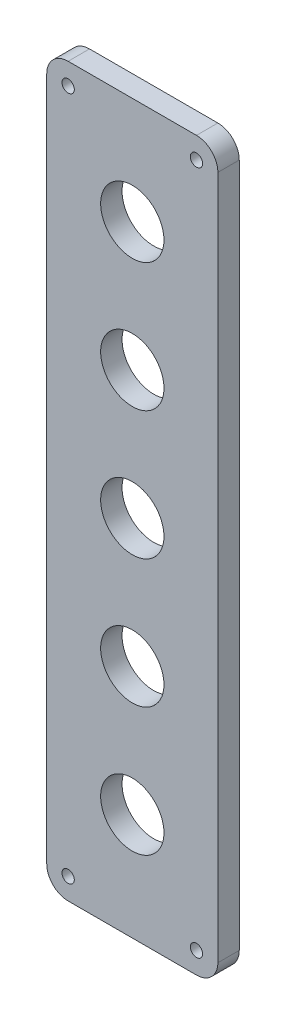
ISO-10303-21;
HEADER;
FILE_DESCRIPTION(('STEP AP214'),'2;1');
FILE_NAME('part.step','',(''),(''),'','','');
FILE_SCHEMA(('AUTOMOTIVE_DESIGN { 1 0 10303 214 1 1 1 1 }'));
ENDSEC;
DATA;
#1=APPLICATION_CONTEXT('core data for automotive mechanical design processes');
#2=APPLICATION_PROTOCOL_DEFINITION('international standard','automotive_design',2000,#1);
#3=PRODUCT_CONTEXT('',#1,'mechanical');
#4=PRODUCT('Part','Part','',(#3));
#5=PRODUCT_RELATED_PRODUCT_CATEGORY('part','',(#4));
#6=PRODUCT_DEFINITION_FORMATION('','',#4);
#7=PRODUCT_DEFINITION_CONTEXT('part definition',#1,'design');
#8=PRODUCT_DEFINITION('design','',#6,#7);
#9=PRODUCT_DEFINITION_SHAPE('','',#8);
#10=(LENGTH_UNIT() NAMED_UNIT(*) SI_UNIT(.MILLI.,.METRE.));
#11=(NAMED_UNIT(*) PLANE_ANGLE_UNIT() SI_UNIT($,.RADIAN.));
#12=(NAMED_UNIT(*) SI_UNIT($,.STERADIAN.) SOLID_ANGLE_UNIT());
#13=UNCERTAINTY_MEASURE_WITH_UNIT(LENGTH_MEASURE(1.E-05),#10,'distance_accuracy_value','');
#14=(GEOMETRIC_REPRESENTATION_CONTEXT(3) GLOBAL_UNCERTAINTY_ASSIGNED_CONTEXT((#13)) GLOBAL_UNIT_ASSIGNED_CONTEXT((#10,
#11,#12)) REPRESENTATION_CONTEXT('',''));
#15=CARTESIAN_POINT('',(0.,0.,0.));
#16=DIRECTION('',(0.,0.,1.));
#17=DIRECTION('',(1.,0.,0.));
#18=AXIS2_PLACEMENT_3D('',#15,#16,#17);
#19=CARTESIAN_POINT('',(25.4,-107.95,6.35));
#20=DIRECTION('',(-1.,0.,0.));
#21=DIRECTION('',(0.,0.,1.));
#22=AXIS2_PLACEMENT_3D('',#19,#20,#21);
#23=PLANE('',#22);
#24=DIRECTION('',(0.,1.,0.));
#25=VECTOR('',#24,1.);
#26=CARTESIAN_POINT('',(25.4,-107.95,6.35));
#27=LINE('',#26,#25);
#28=CARTESIAN_POINT('',(25.4,-101.6,6.35));
#29=VERTEX_POINT('',#28);
#30=CARTESIAN_POINT('',(25.4,101.6,6.35));
#31=VERTEX_POINT('',#30);
#32=EDGE_CURVE('E128',#29,#31,#27,.T.);
#33=ORIENTED_EDGE('',*,*,#32,.F.);
#34=DIRECTION('',(0.,0.,-1.));
#35=VECTOR('',#34,1.);
#36=CARTESIAN_POINT('',(25.4,-101.6,6.35));
#37=LINE('',#36,#35);
#38=CARTESIAN_POINT('',(25.4,-101.6,0.));
#39=VERTEX_POINT('',#38);
#40=EDGE_CURVE('E154',#29,#39,#37,.T.);
#41=ORIENTED_EDGE('',*,*,#40,.T.);
#42=DIRECTION('',(0.,1.,0.));
#43=VECTOR('',#42,1.);
#44=CARTESIAN_POINT('',(25.4,-107.95,0.));
#45=LINE('',#44,#43);
#46=CARTESIAN_POINT('',(25.4,101.6,0.));
#47=VERTEX_POINT('',#46);
#48=EDGE_CURVE('E160',#39,#47,#45,.T.);
#49=ORIENTED_EDGE('',*,*,#48,.T.);
#50=DIRECTION('',(0.,0.,-1.));
#51=VECTOR('',#50,1.);
#52=CARTESIAN_POINT('',(25.4,101.6,6.35));
#53=LINE('',#52,#51);
#54=EDGE_CURVE('E152',#47,#31,#53,.F.);
#55=ORIENTED_EDGE('',*,*,#54,.T.);
#56=EDGE_LOOP('',(#33,#41,#49,#55));
#57=FACE_BOUND('',#56,.T.);
#58=ADVANCED_FACE('F36',(#57),#23,.F.);
#59=CARTESIAN_POINT('',(-25.4,107.95,6.35));
#60=DIRECTION('',(0.,-1.,0.));
#61=DIRECTION('',(0.,0.,-1.));
#62=AXIS2_PLACEMENT_3D('',#59,#60,#61);
#63=PLANE('',#62);
#64=DIRECTION('',(-1.,0.,0.));
#65=VECTOR('',#64,1.);
#66=CARTESIAN_POINT('',(-25.4,107.95,6.35));
#67=LINE('',#66,#65);
#68=CARTESIAN_POINT('',(19.05,107.95,6.35));
#69=VERTEX_POINT('',#68);
#70=CARTESIAN_POINT('',(-19.05,107.95,6.35));
#71=VERTEX_POINT('',#70);
#72=EDGE_CURVE('E131',#69,#71,#67,.T.);
#73=ORIENTED_EDGE('',*,*,#72,.F.);
#74=DIRECTION('',(0.,0.,-1.));
#75=VECTOR('',#74,1.);
#76=CARTESIAN_POINT('',(19.05,107.95,6.35));
#77=LINE('',#76,#75);
#78=CARTESIAN_POINT('',(19.05,107.95,0.));
#79=VERTEX_POINT('',#78);
#80=EDGE_CURVE('E11',#69,#79,#77,.T.);
#81=ORIENTED_EDGE('',*,*,#80,.T.);
#82=DIRECTION('',(-1.,0.,0.));
#83=VECTOR('',#82,1.);
#84=CARTESIAN_POINT('',(-25.4,107.95,0.));
#85=LINE('',#84,#83);
#86=CARTESIAN_POINT('',(-19.05,107.95,0.));
#87=VERTEX_POINT('',#86);
#88=EDGE_CURVE('E133',#79,#87,#85,.T.);
#89=ORIENTED_EDGE('',*,*,#88,.T.);
#90=DIRECTION('',(0.,0.,-1.));
#91=VECTOR('',#90,1.);
#92=CARTESIAN_POINT('',(-19.05,107.95,6.35));
#93=LINE('',#92,#91);
#94=EDGE_CURVE('E44',#87,#71,#93,.F.);
#95=ORIENTED_EDGE('',*,*,#94,.T.);
#96=EDGE_LOOP('',(#73,#81,#89,#95));
#97=FACE_BOUND('',#96,.T.);
#98=ADVANCED_FACE('F254',(#97),#63,.F.);
#99=CARTESIAN_POINT('',(-25.4,-107.95,6.35));
#100=DIRECTION('',(1.,0.,0.));
#101=DIRECTION('',(0.,0.,-1.));
#102=AXIS2_PLACEMENT_3D('',#99,#100,#101);
#103=PLANE('',#102);
#104=DIRECTION('',(0.,-1.,0.));
#105=VECTOR('',#104,1.);
#106=CARTESIAN_POINT('',(-25.4,-107.95,0.));
#107=LINE('',#106,#105);
#108=CARTESIAN_POINT('',(-25.4,101.6,0.));
#109=VERTEX_POINT('',#108);
#110=CARTESIAN_POINT('',(-25.4,-101.6,0.));
#111=VERTEX_POINT('',#110);
#112=EDGE_CURVE('E129',#109,#111,#107,.T.);
#113=ORIENTED_EDGE('',*,*,#112,.T.);
#114=DIRECTION('',(0.,0.,-1.));
#115=VECTOR('',#114,1.);
#116=CARTESIAN_POINT('',(-25.4,-101.6,6.35));
#117=LINE('',#116,#115);
#118=CARTESIAN_POINT('',(-25.4,-101.6,6.35));
#119=VERTEX_POINT('',#118);
#120=EDGE_CURVE('E107',#111,#119,#117,.F.);
#121=ORIENTED_EDGE('',*,*,#120,.T.);
#122=DIRECTION('',(0.,-1.,0.));
#123=VECTOR('',#122,1.);
#124=CARTESIAN_POINT('',(-25.4,-107.95,6.35));
#125=LINE('',#124,#123);
#126=CARTESIAN_POINT('',(-25.4,101.6,6.35));
#127=VERTEX_POINT('',#126);
#128=EDGE_CURVE('E172',#127,#119,#125,.T.);
#129=ORIENTED_EDGE('',*,*,#128,.F.);
#130=DIRECTION('',(0.,0.,-1.));
#131=VECTOR('',#130,1.);
#132=CARTESIAN_POINT('',(-25.4,101.6,6.35));
#133=LINE('',#132,#131);
#134=EDGE_CURVE('E112',#127,#109,#133,.T.);
#135=ORIENTED_EDGE('',*,*,#134,.T.);
#136=EDGE_LOOP('',(#113,#121,#129,#135));
#137=FACE_BOUND('',#136,.T.);
#138=ADVANCED_FACE('F252',(#137),#103,.F.);
#139=CARTESIAN_POINT('',(-25.4,-107.95,6.35));
#140=DIRECTION('',(0.,1.,0.));
#141=DIRECTION('',(0.,0.,1.));
#142=AXIS2_PLACEMENT_3D('',#139,#140,#141);
#143=PLANE('',#142);
#144=DIRECTION('',(1.,0.,0.));
#145=VECTOR('',#144,1.);
#146=CARTESIAN_POINT('',(-25.4,-107.95,6.35));
#147=LINE('',#146,#145);
#148=CARTESIAN_POINT('',(-19.05,-107.95,6.35));
#149=VERTEX_POINT('',#148);
#150=CARTESIAN_POINT('',(19.05,-107.95,6.35));
#151=VERTEX_POINT('',#150);
#152=EDGE_CURVE('E122',#149,#151,#147,.T.);
#153=ORIENTED_EDGE('',*,*,#152,.F.);
#154=DIRECTION('',(0.,0.,-1.));
#155=VECTOR('',#154,1.);
#156=CARTESIAN_POINT('',(-19.05,-107.95,6.35));
#157=LINE('',#156,#155);
#158=CARTESIAN_POINT('',(-19.05,-107.95,0.));
#159=VERTEX_POINT('',#158);
#160=EDGE_CURVE('E106',#149,#159,#157,.T.);
#161=ORIENTED_EDGE('',*,*,#160,.T.);
#162=DIRECTION('',(1.,0.,0.));
#163=VECTOR('',#162,1.);
#164=CARTESIAN_POINT('',(-25.4,-107.95,0.));
#165=LINE('',#164,#163);
#166=CARTESIAN_POINT('',(19.05,-107.95,0.));
#167=VERTEX_POINT('',#166);
#168=EDGE_CURVE('E119',#159,#167,#165,.T.);
#169=ORIENTED_EDGE('',*,*,#168,.T.);
#170=DIRECTION('',(0.,0.,-1.));
#171=VECTOR('',#170,1.);
#172=CARTESIAN_POINT('',(19.05,-107.95,6.35));
#173=LINE('',#172,#171);
#174=EDGE_CURVE('E124',#167,#151,#173,.F.);
#175=ORIENTED_EDGE('',*,*,#174,.T.);
#176=EDGE_LOOP('',(#153,#161,#169,#175));
#177=FACE_BOUND('',#176,.T.);
#178=ADVANCED_FACE('F118',(#177),#143,.F.);
#179=CARTESIAN_POINT('',(0.,0.,6.35));
#180=DIRECTION('',(0.,0.,-1.));
#181=DIRECTION('',(-1.,0.,0.));
#182=AXIS2_PLACEMENT_3D('',#179,#180,#181);
#183=PLANE('',#182);
#184=CARTESIAN_POINT('',(19.05,101.6,6.35));
#185=DIRECTION('',(0.,0.,1.));
#186=DIRECTION('',(1.,0.,0.));
#187=AXIS2_PLACEMENT_3D('',#184,#185,#186);
#188=CIRCLE('',#187,1.8288);
#189=CARTESIAN_POINT('',(20.8788,101.6,6.35));
#190=VERTEX_POINT('',#189);
#191=EDGE_CURVE('E223',#190,#190,#188,.T.);
#192=ORIENTED_EDGE('',*,*,#191,.F.);
#193=EDGE_LOOP('',(#192));
#194=FACE_BOUND('',#193,.T.);
#195=CARTESIAN_POINT('',(-19.05,-101.6,6.35));
#196=DIRECTION('',(0.,0.,1.));
#197=DIRECTION('',(1.,0.,0.));
#198=AXIS2_PLACEMENT_3D('',#195,#196,#197);
#199=CIRCLE('',#198,1.8288);
#200=CARTESIAN_POINT('',(-17.2212,-101.6,6.35));
#201=VERTEX_POINT('',#200);
#202=EDGE_CURVE('E217',#201,#201,#199,.T.);
#203=ORIENTED_EDGE('',*,*,#202,.F.);
#204=EDGE_LOOP('',(#203));
#205=FACE_BOUND('',#204,.T.);
#206=CARTESIAN_POINT('',(-19.05,101.6,6.35));
#207=DIRECTION('',(0.,0.,1.));
#208=DIRECTION('',(1.,0.,0.));
#209=AXIS2_PLACEMENT_3D('',#206,#207,#208);
#210=CIRCLE('',#209,1.8288);
#211=CARTESIAN_POINT('',(-17.2212,101.6,6.35));
#212=VERTEX_POINT('',#211);
#213=EDGE_CURVE('E211',#212,#212,#210,.T.);
#214=ORIENTED_EDGE('',*,*,#213,.F.);
#215=EDGE_LOOP('',(#214));
#216=FACE_BOUND('',#215,.T.);
#217=CARTESIAN_POINT('',(19.05,-101.6,6.35));
#218=DIRECTION('',(0.,0.,1.));
#219=DIRECTION('',(1.,0.,0.));
#220=AXIS2_PLACEMENT_3D('',#217,#218,#219);
#221=CIRCLE('',#220,1.8288);
#222=CARTESIAN_POINT('',(20.8788,-101.6,6.35));
#223=VERTEX_POINT('',#222);
#224=EDGE_CURVE('E205',#223,#223,#221,.T.);
#225=ORIENTED_EDGE('',*,*,#224,.F.);
#226=EDGE_LOOP('',(#225));
#227=FACE_BOUND('',#226,.T.);
#228=CARTESIAN_POINT('',(0.,-76.2,6.35));
#229=DIRECTION('',(0.,0.,1.));
#230=DIRECTION('',(1.,0.,0.));
#231=AXIS2_PLACEMENT_3D('',#228,#229,#230);
#232=CIRCLE('',#231,9.398);
#233=CARTESIAN_POINT('',(9.398,-76.2,6.35));
#234=VERTEX_POINT('',#233);
#235=EDGE_CURVE('E199',#234,#234,#232,.T.);
#236=ORIENTED_EDGE('',*,*,#235,.F.);
#237=EDGE_LOOP('',(#236));
#238=FACE_BOUND('',#237,.T.);
#239=CARTESIAN_POINT('',(0.,38.1,6.35));
#240=DIRECTION('',(0.,0.,1.));
#241=DIRECTION('',(1.,0.,0.));
#242=AXIS2_PLACEMENT_3D('',#239,#240,#241);
#243=CIRCLE('',#242,9.398);
#244=CARTESIAN_POINT('',(9.398,38.1,6.35));
#245=VERTEX_POINT('',#244);
#246=EDGE_CURVE('E193',#245,#245,#243,.T.);
#247=ORIENTED_EDGE('',*,*,#246,.F.);
#248=EDGE_LOOP('',(#247));
#249=FACE_BOUND('',#248,.T.);
#250=CARTESIAN_POINT('',(0.,76.2,6.35));
#251=DIRECTION('',(0.,0.,1.));
#252=DIRECTION('',(1.,0.,0.));
#253=AXIS2_PLACEMENT_3D('',#250,#251,#252);
#254=CIRCLE('',#253,9.398);
#255=CARTESIAN_POINT('',(9.398,76.2,6.35));
#256=VERTEX_POINT('',#255);
#257=EDGE_CURVE('E187',#256,#256,#254,.T.);
#258=ORIENTED_EDGE('',*,*,#257,.F.);
#259=EDGE_LOOP('',(#258));
#260=FACE_BOUND('',#259,.T.);
#261=CARTESIAN_POINT('',(0.,-38.1,6.35));
#262=DIRECTION('',(0.,0.,1.));
#263=DIRECTION('',(1.,0.,0.));
#264=AXIS2_PLACEMENT_3D('',#261,#262,#263);
#265=CIRCLE('',#264,9.398);
#266=CARTESIAN_POINT('',(9.398,-38.1,6.35));
#267=VERTEX_POINT('',#266);
#268=EDGE_CURVE('E177',#267,#267,#265,.T.);
#269=ORIENTED_EDGE('',*,*,#268,.F.);
#270=EDGE_LOOP('',(#269));
#271=FACE_BOUND('',#270,.T.);
#272=CARTESIAN_POINT('',(0.,0.,6.35));
#273=DIRECTION('',(0.,0.,1.));
#274=DIRECTION('',(1.,0.,0.));
#275=AXIS2_PLACEMENT_3D('',#272,#273,#274);
#276=CIRCLE('',#275,9.398);
#277=CARTESIAN_POINT('',(9.398,0.,6.35));
#278=VERTEX_POINT('',#277);
#279=EDGE_CURVE('E168',#278,#278,#276,.T.);
#280=ORIENTED_EDGE('',*,*,#279,.F.);
#281=EDGE_LOOP('',(#280));
#282=FACE_BOUND('',#281,.T.);
#283=ORIENTED_EDGE('',*,*,#128,.T.);
#284=CARTESIAN_POINT('',(-19.05,-101.6,6.35));
#285=DIRECTION('',(0.,0.,-1.));
#286=DIRECTION('',(-1.,0.,0.));
#287=AXIS2_PLACEMENT_3D('',#284,#285,#286);
#288=CIRCLE('',#287,6.35);
#289=EDGE_CURVE('E150',#119,#149,#288,.F.);
#290=ORIENTED_EDGE('',*,*,#289,.T.);
#291=ORIENTED_EDGE('',*,*,#152,.T.);
#292=CARTESIAN_POINT('',(19.05,-101.6,6.35));
#293=DIRECTION('',(0.,0.,-1.));
#294=DIRECTION('',(-1.,0.,0.));
#295=AXIS2_PLACEMENT_3D('',#292,#293,#294);
#296=CIRCLE('',#295,6.35);
#297=EDGE_CURVE('E148',#151,#29,#296,.F.);
#298=ORIENTED_EDGE('',*,*,#297,.T.);
#299=ORIENTED_EDGE('',*,*,#32,.T.);
#300=CARTESIAN_POINT('',(19.05,101.6,6.35));
#301=DIRECTION('',(0.,0.,-1.));
#302=DIRECTION('',(-1.,0.,0.));
#303=AXIS2_PLACEMENT_3D('',#300,#301,#302);
#304=CIRCLE('',#303,6.35);
#305=EDGE_CURVE('E57',#31,#69,#304,.F.);
#306=ORIENTED_EDGE('',*,*,#305,.T.);
#307=ORIENTED_EDGE('',*,*,#72,.T.);
#308=CARTESIAN_POINT('',(-19.05,101.6,6.35));
#309=DIRECTION('',(0.,0.,-1.));
#310=DIRECTION('',(-1.,0.,0.));
#311=AXIS2_PLACEMENT_3D('',#308,#309,#310);
#312=CIRCLE('',#311,6.35);
#313=EDGE_CURVE('E145',#71,#127,#312,.F.);
#314=ORIENTED_EDGE('',*,*,#313,.T.);
#315=EDGE_LOOP('',(#283,#290,#291,#298,#299,#306,#307,#314));
#316=FACE_BOUND('',#315,.T.);
#317=ADVANCED_FACE('F229',(#194,#205,#216,#227,#238,#249,#260,#271,#282,#316),#183,.F.);
#318=CARTESIAN_POINT('',(0.,0.,0.));
#319=DIRECTION('',(0.,0.,-1.));
#320=DIRECTION('',(-1.,0.,0.));
#321=AXIS2_PLACEMENT_3D('',#318,#319,#320);
#322=PLANE('',#321);
#323=CARTESIAN_POINT('',(19.05,101.6,0.));
#324=DIRECTION('',(0.,0.,1.));
#325=DIRECTION('',(1.,0.,0.));
#326=AXIS2_PLACEMENT_3D('',#323,#324,#325);
#327=CIRCLE('',#326,1.8288);
#328=CARTESIAN_POINT('',(20.8788,101.6,0.));
#329=VERTEX_POINT('',#328);
#330=EDGE_CURVE('E220',#329,#329,#327,.T.);
#331=ORIENTED_EDGE('',*,*,#330,.T.);
#332=EDGE_LOOP('',(#331));
#333=FACE_BOUND('',#332,.T.);
#334=CARTESIAN_POINT('',(-19.05,-101.6,0.));
#335=DIRECTION('',(0.,0.,1.));
#336=DIRECTION('',(1.,0.,0.));
#337=AXIS2_PLACEMENT_3D('',#334,#335,#336);
#338=CIRCLE('',#337,1.8288);
#339=CARTESIAN_POINT('',(-17.2212,-101.6,0.));
#340=VERTEX_POINT('',#339);
#341=EDGE_CURVE('E214',#340,#340,#338,.T.);
#342=ORIENTED_EDGE('',*,*,#341,.T.);
#343=EDGE_LOOP('',(#342));
#344=FACE_BOUND('',#343,.T.);
#345=CARTESIAN_POINT('',(-19.05,101.6,0.));
#346=DIRECTION('',(0.,0.,1.));
#347=DIRECTION('',(1.,0.,0.));
#348=AXIS2_PLACEMENT_3D('',#345,#346,#347);
#349=CIRCLE('',#348,1.8288);
#350=CARTESIAN_POINT('',(-17.2212,101.6,0.));
#351=VERTEX_POINT('',#350);
#352=EDGE_CURVE('E208',#351,#351,#349,.T.);
#353=ORIENTED_EDGE('',*,*,#352,.T.);
#354=EDGE_LOOP('',(#353));
#355=FACE_BOUND('',#354,.T.);
#356=CARTESIAN_POINT('',(19.05,-101.6,0.));
#357=DIRECTION('',(0.,0.,1.));
#358=DIRECTION('',(1.,0.,0.));
#359=AXIS2_PLACEMENT_3D('',#356,#357,#358);
#360=CIRCLE('',#359,1.8288);
#361=CARTESIAN_POINT('',(20.8788,-101.6,0.));
#362=VERTEX_POINT('',#361);
#363=EDGE_CURVE('E202',#362,#362,#360,.T.);
#364=ORIENTED_EDGE('',*,*,#363,.T.);
#365=EDGE_LOOP('',(#364));
#366=FACE_BOUND('',#365,.T.);
#367=CARTESIAN_POINT('',(0.,-76.2,0.));
#368=DIRECTION('',(0.,0.,1.));
#369=DIRECTION('',(1.,0.,0.));
#370=AXIS2_PLACEMENT_3D('',#367,#368,#369);
#371=CIRCLE('',#370,9.398);
#372=CARTESIAN_POINT('',(9.398,-76.2,0.));
#373=VERTEX_POINT('',#372);
#374=EDGE_CURVE('E196',#373,#373,#371,.T.);
#375=ORIENTED_EDGE('',*,*,#374,.T.);
#376=EDGE_LOOP('',(#375));
#377=FACE_BOUND('',#376,.T.);
#378=CARTESIAN_POINT('',(0.,38.1,0.));
#379=DIRECTION('',(0.,0.,1.));
#380=DIRECTION('',(1.,0.,0.));
#381=AXIS2_PLACEMENT_3D('',#378,#379,#380);
#382=CIRCLE('',#381,9.398);
#383=CARTESIAN_POINT('',(9.398,38.1,0.));
#384=VERTEX_POINT('',#383);
#385=EDGE_CURVE('E190',#384,#384,#382,.T.);
#386=ORIENTED_EDGE('',*,*,#385,.T.);
#387=EDGE_LOOP('',(#386));
#388=FACE_BOUND('',#387,.T.);
#389=CARTESIAN_POINT('',(0.,76.2,0.));
#390=DIRECTION('',(0.,0.,1.));
#391=DIRECTION('',(1.,0.,0.));
#392=AXIS2_PLACEMENT_3D('',#389,#390,#391);
#393=CIRCLE('',#392,9.398);
#394=CARTESIAN_POINT('',(9.398,76.2,0.));
#395=VERTEX_POINT('',#394);
#396=EDGE_CURVE('E184',#395,#395,#393,.T.);
#397=ORIENTED_EDGE('',*,*,#396,.T.);
#398=EDGE_LOOP('',(#397));
#399=FACE_BOUND('',#398,.T.);
#400=CARTESIAN_POINT('',(0.,-38.1,0.));
#401=DIRECTION('',(0.,0.,1.));
#402=DIRECTION('',(1.,0.,0.));
#403=AXIS2_PLACEMENT_3D('',#400,#401,#402);
#404=CIRCLE('',#403,9.398);
#405=CARTESIAN_POINT('',(9.398,-38.1,0.));
#406=VERTEX_POINT('',#405);
#407=EDGE_CURVE('E181',#406,#406,#404,.T.);
#408=ORIENTED_EDGE('',*,*,#407,.T.);
#409=EDGE_LOOP('',(#408));
#410=FACE_BOUND('',#409,.T.);
#411=CARTESIAN_POINT('',(0.,0.,0.));
#412=DIRECTION('',(0.,0.,1.));
#413=DIRECTION('',(1.,0.,0.));
#414=AXIS2_PLACEMENT_3D('',#411,#412,#413);
#415=CIRCLE('',#414,9.398);
#416=CARTESIAN_POINT('',(9.398,0.,0.));
#417=VERTEX_POINT('',#416);
#418=EDGE_CURVE('E165',#417,#417,#415,.T.);
#419=ORIENTED_EDGE('',*,*,#418,.T.);
#420=EDGE_LOOP('',(#419));
#421=FACE_BOUND('',#420,.T.);
#422=ORIENTED_EDGE('',*,*,#168,.F.);
#423=CARTESIAN_POINT('',(-19.05,-101.6,0.));
#424=DIRECTION('',(0.,0.,-1.));
#425=DIRECTION('',(-1.,0.,0.));
#426=AXIS2_PLACEMENT_3D('',#423,#424,#425);
#427=CIRCLE('',#426,6.35);
#428=EDGE_CURVE('E102',#159,#111,#427,.T.);
#429=ORIENTED_EDGE('',*,*,#428,.T.);
#430=ORIENTED_EDGE('',*,*,#112,.F.);
#431=CARTESIAN_POINT('',(-19.05,101.6,0.));
#432=DIRECTION('',(0.,0.,-1.));
#433=DIRECTION('',(-1.,0.,0.));
#434=AXIS2_PLACEMENT_3D('',#431,#432,#433);
#435=CIRCLE('',#434,6.35);
#436=EDGE_CURVE('E123',#109,#87,#435,.T.);
#437=ORIENTED_EDGE('',*,*,#436,.T.);
#438=ORIENTED_EDGE('',*,*,#88,.F.);
#439=CARTESIAN_POINT('',(19.05,101.6,0.));
#440=DIRECTION('',(0.,0.,-1.));
#441=DIRECTION('',(-1.,0.,0.));
#442=AXIS2_PLACEMENT_3D('',#439,#440,#441);
#443=CIRCLE('',#442,6.35);
#444=EDGE_CURVE('E139',#79,#47,#443,.T.);
#445=ORIENTED_EDGE('',*,*,#444,.T.);
#446=ORIENTED_EDGE('',*,*,#48,.F.);
#447=CARTESIAN_POINT('',(19.05,-101.6,0.));
#448=DIRECTION('',(0.,0.,-1.));
#449=DIRECTION('',(-1.,0.,0.));
#450=AXIS2_PLACEMENT_3D('',#447,#448,#449);
#451=CIRCLE('',#450,6.35);
#452=EDGE_CURVE('E113',#39,#167,#451,.T.);
#453=ORIENTED_EDGE('',*,*,#452,.T.);
#454=EDGE_LOOP('',(#422,#429,#430,#437,#438,#445,#446,#453));
#455=FACE_BOUND('',#454,.T.);
#456=ADVANCED_FACE('F126',(#333,#344,#355,#366,#377,#388,#399,#410,#421,#455),#322,.T.);
#457=CARTESIAN_POINT('',(0.,0.,0.));
#458=DIRECTION('',(0.,0.,1.));
#459=DIRECTION('',(1.,0.,0.));
#460=AXIS2_PLACEMENT_3D('',#457,#458,#459);
#461=CYLINDRICAL_SURFACE('',#460,9.398);
#462=ORIENTED_EDGE('',*,*,#418,.F.);
#463=EDGE_LOOP('',(#462));
#464=FACE_BOUND('',#463,.T.);
#465=ORIENTED_EDGE('',*,*,#279,.T.);
#466=EDGE_LOOP('',(#465));
#467=FACE_BOUND('',#466,.T.);
#468=ADVANCED_FACE('F278',(#464,#467),#461,.F.);
#469=CARTESIAN_POINT('',(0.,-38.1,0.));
#470=DIRECTION('',(0.,0.,1.));
#471=DIRECTION('',(1.,0.,0.));
#472=AXIS2_PLACEMENT_3D('',#469,#470,#471);
#473=CYLINDRICAL_SURFACE('',#472,9.398);
#474=ORIENTED_EDGE('',*,*,#407,.F.);
#475=EDGE_LOOP('',(#474));
#476=FACE_BOUND('',#475,.T.);
#477=ORIENTED_EDGE('',*,*,#268,.T.);
#478=EDGE_LOOP('',(#477));
#479=FACE_BOUND('',#478,.T.);
#480=ADVANCED_FACE('F283',(#476,#479),#473,.F.);
#481=CARTESIAN_POINT('',(0.,76.2,0.));
#482=DIRECTION('',(0.,0.,1.));
#483=DIRECTION('',(1.,0.,0.));
#484=AXIS2_PLACEMENT_3D('',#481,#482,#483);
#485=CYLINDRICAL_SURFACE('',#484,9.398);
#486=ORIENTED_EDGE('',*,*,#396,.F.);
#487=EDGE_LOOP('',(#486));
#488=FACE_BOUND('',#487,.T.);
#489=ORIENTED_EDGE('',*,*,#257,.T.);
#490=EDGE_LOOP('',(#489));
#491=FACE_BOUND('',#490,.T.);
#492=ADVANCED_FACE('F287',(#488,#491),#485,.F.);
#493=CARTESIAN_POINT('',(0.,38.1,0.));
#494=DIRECTION('',(0.,0.,1.));
#495=DIRECTION('',(1.,0.,0.));
#496=AXIS2_PLACEMENT_3D('',#493,#494,#495);
#497=CYLINDRICAL_SURFACE('',#496,9.398);
#498=ORIENTED_EDGE('',*,*,#385,.F.);
#499=EDGE_LOOP('',(#498));
#500=FACE_BOUND('',#499,.T.);
#501=ORIENTED_EDGE('',*,*,#246,.T.);
#502=EDGE_LOOP('',(#501));
#503=FACE_BOUND('',#502,.T.);
#504=ADVANCED_FACE('F291',(#500,#503),#497,.F.);
#505=CARTESIAN_POINT('',(0.,-76.2,0.));
#506=DIRECTION('',(0.,0.,1.));
#507=DIRECTION('',(1.,0.,0.));
#508=AXIS2_PLACEMENT_3D('',#505,#506,#507);
#509=CYLINDRICAL_SURFACE('',#508,9.398);
#510=ORIENTED_EDGE('',*,*,#374,.F.);
#511=EDGE_LOOP('',(#510));
#512=FACE_BOUND('',#511,.T.);
#513=ORIENTED_EDGE('',*,*,#235,.T.);
#514=EDGE_LOOP('',(#513));
#515=FACE_BOUND('',#514,.T.);
#516=ADVANCED_FACE('F295',(#512,#515),#509,.F.);
#517=CARTESIAN_POINT('',(19.05,-101.6,6.35));
#518=DIRECTION('',(0.,0.,1.));
#519=DIRECTION('',(1.,0.,0.));
#520=AXIS2_PLACEMENT_3D('',#517,#518,#519);
#521=CYLINDRICAL_SURFACE('',#520,1.8288);
#522=ORIENTED_EDGE('',*,*,#363,.F.);
#523=EDGE_LOOP('',(#522));
#524=FACE_BOUND('',#523,.T.);
#525=ORIENTED_EDGE('',*,*,#224,.T.);
#526=EDGE_LOOP('',(#525));
#527=FACE_BOUND('',#526,.T.);
#528=ADVANCED_FACE('F299',(#524,#527),#521,.F.);
#529=CARTESIAN_POINT('',(-19.05,101.6,6.35));
#530=DIRECTION('',(0.,0.,1.));
#531=DIRECTION('',(1.,0.,0.));
#532=AXIS2_PLACEMENT_3D('',#529,#530,#531);
#533=CYLINDRICAL_SURFACE('',#532,1.8288);
#534=ORIENTED_EDGE('',*,*,#352,.F.);
#535=EDGE_LOOP('',(#534));
#536=FACE_BOUND('',#535,.T.);
#537=ORIENTED_EDGE('',*,*,#213,.T.);
#538=EDGE_LOOP('',(#537));
#539=FACE_BOUND('',#538,.T.);
#540=ADVANCED_FACE('F303',(#536,#539),#533,.F.);
#541=CARTESIAN_POINT('',(-19.05,-101.6,6.35));
#542=DIRECTION('',(0.,0.,1.));
#543=DIRECTION('',(1.,0.,0.));
#544=AXIS2_PLACEMENT_3D('',#541,#542,#543);
#545=CYLINDRICAL_SURFACE('',#544,1.8288);
#546=ORIENTED_EDGE('',*,*,#341,.F.);
#547=EDGE_LOOP('',(#546));
#548=FACE_BOUND('',#547,.T.);
#549=ORIENTED_EDGE('',*,*,#202,.T.);
#550=EDGE_LOOP('',(#549));
#551=FACE_BOUND('',#550,.T.);
#552=ADVANCED_FACE('F307',(#548,#551),#545,.F.);
#553=CARTESIAN_POINT('',(19.05,101.6,6.35));
#554=DIRECTION('',(0.,0.,1.));
#555=DIRECTION('',(1.,0.,0.));
#556=AXIS2_PLACEMENT_3D('',#553,#554,#555);
#557=CYLINDRICAL_SURFACE('',#556,1.8288);
#558=ORIENTED_EDGE('',*,*,#330,.F.);
#559=EDGE_LOOP('',(#558));
#560=FACE_BOUND('',#559,.T.);
#561=ORIENTED_EDGE('',*,*,#191,.T.);
#562=EDGE_LOOP('',(#561));
#563=FACE_BOUND('',#562,.T.);
#564=ADVANCED_FACE('F227',(#560,#563),#557,.F.);
#565=CARTESIAN_POINT('',(-19.05,-101.6,6.35));
#566=DIRECTION('',(0.,0.,-1.));
#567=DIRECTION('',(-1.,0.,0.));
#568=AXIS2_PLACEMENT_3D('',#565,#566,#567);
#569=CYLINDRICAL_SURFACE('',#568,6.35);
#570=ORIENTED_EDGE('',*,*,#289,.F.);
#571=ORIENTED_EDGE('',*,*,#120,.F.);
#572=ORIENTED_EDGE('',*,*,#428,.F.);
#573=ORIENTED_EDGE('',*,*,#160,.F.);
#574=EDGE_LOOP('',(#570,#571,#572,#573));
#575=FACE_BOUND('',#574,.T.);
#576=ADVANCED_FACE('F105',(#575),#569,.T.);
#577=CARTESIAN_POINT('',(19.05,-101.6,6.35));
#578=DIRECTION('',(0.,0.,-1.));
#579=DIRECTION('',(-1.,0.,0.));
#580=AXIS2_PLACEMENT_3D('',#577,#578,#579);
#581=CYLINDRICAL_SURFACE('',#580,6.35);
#582=ORIENTED_EDGE('',*,*,#297,.F.);
#583=ORIENTED_EDGE('',*,*,#174,.F.);
#584=ORIENTED_EDGE('',*,*,#452,.F.);
#585=ORIENTED_EDGE('',*,*,#40,.F.);
#586=EDGE_LOOP('',(#582,#583,#584,#585));
#587=FACE_BOUND('',#586,.T.);
#588=ADVANCED_FACE('F258',(#587),#581,.T.);
#589=CARTESIAN_POINT('',(19.05,101.6,6.35));
#590=DIRECTION('',(0.,0.,-1.));
#591=DIRECTION('',(-1.,0.,0.));
#592=AXIS2_PLACEMENT_3D('',#589,#590,#591);
#593=CYLINDRICAL_SURFACE('',#592,6.35);
#594=ORIENTED_EDGE('',*,*,#305,.F.);
#595=ORIENTED_EDGE('',*,*,#54,.F.);
#596=ORIENTED_EDGE('',*,*,#444,.F.);
#597=ORIENTED_EDGE('',*,*,#80,.F.);
#598=EDGE_LOOP('',(#594,#595,#596,#597));
#599=FACE_BOUND('',#598,.T.);
#600=ADVANCED_FACE('F257',(#599),#593,.T.);
#601=CARTESIAN_POINT('',(-19.05,101.6,6.35));
#602=DIRECTION('',(0.,0.,-1.));
#603=DIRECTION('',(-1.,0.,0.));
#604=AXIS2_PLACEMENT_3D('',#601,#602,#603);
#605=CYLINDRICAL_SURFACE('',#604,6.35);
#606=ORIENTED_EDGE('',*,*,#313,.F.);
#607=ORIENTED_EDGE('',*,*,#94,.F.);
#608=ORIENTED_EDGE('',*,*,#436,.F.);
#609=ORIENTED_EDGE('',*,*,#134,.F.);
#610=EDGE_LOOP('',(#606,#607,#608,#609));
#611=FACE_BOUND('',#610,.T.);
#612=ADVANCED_FACE('F38',(#611),#605,.T.);
#613=CLOSED_SHELL('',(#58,#98,#138,#178,#317,#456,#468,#480,#492,#504,#516,#528,#540,#552,#564,
#576,#588,#600,#612));
#614=MANIFOLD_SOLID_BREP('B2',#613);
#615=ADVANCED_BREP_SHAPE_REPRESENTATION('',(#18,#614),#14);
#616=SHAPE_DEFINITION_REPRESENTATION(#9,#615);
ENDSEC;
END-ISO-10303-21;
